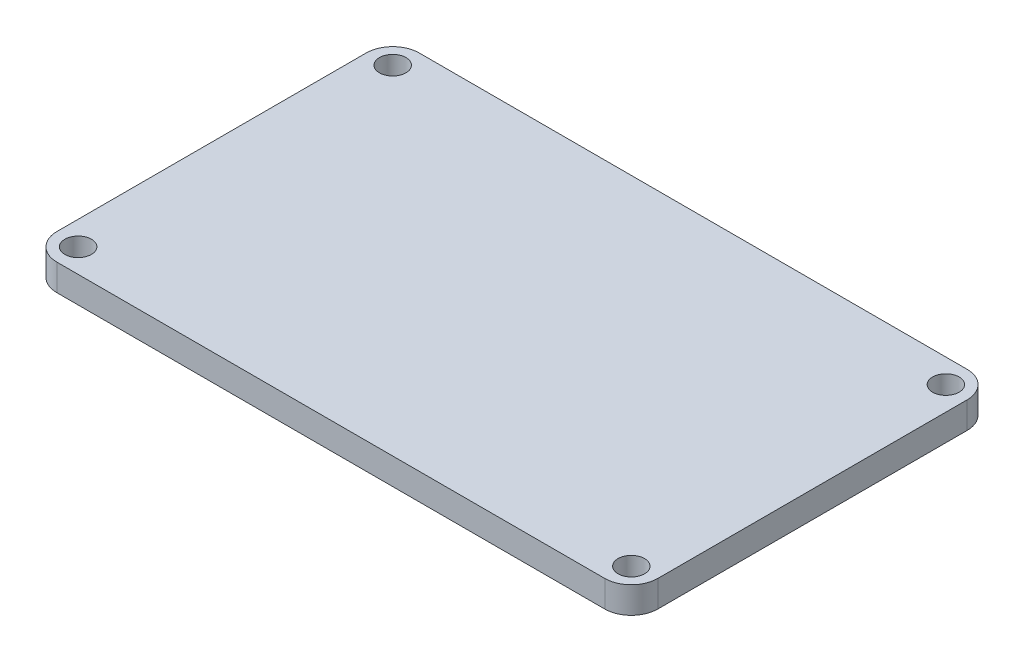
ISO-10303-21;
HEADER;
FILE_DESCRIPTION(('STEP AP214'),'2;1');
FILE_NAME('part.step','',(''),(''),'','','');
FILE_SCHEMA(('AUTOMOTIVE_DESIGN { 1 0 10303 214 1 1 1 1 }'));
ENDSEC;
DATA;
#1=APPLICATION_CONTEXT('core data for automotive mechanical design processes');
#2=APPLICATION_PROTOCOL_DEFINITION('international standard','automotive_design',2000,#1);
#3=PRODUCT_CONTEXT('',#1,'mechanical');
#4=PRODUCT('Part','Part','',(#3));
#5=PRODUCT_RELATED_PRODUCT_CATEGORY('part','',(#4));
#6=PRODUCT_DEFINITION_FORMATION('','',#4);
#7=PRODUCT_DEFINITION_CONTEXT('part definition',#1,'design');
#8=PRODUCT_DEFINITION('design','',#6,#7);
#9=PRODUCT_DEFINITION_SHAPE('','',#8);
#10=(LENGTH_UNIT() NAMED_UNIT(*) SI_UNIT(.MILLI.,.METRE.));
#11=(NAMED_UNIT(*) PLANE_ANGLE_UNIT() SI_UNIT($,.RADIAN.));
#12=(NAMED_UNIT(*) SI_UNIT($,.STERADIAN.) SOLID_ANGLE_UNIT());
#13=UNCERTAINTY_MEASURE_WITH_UNIT(LENGTH_MEASURE(1.E-05),#10,'distance_accuracy_value','');
#14=(GEOMETRIC_REPRESENTATION_CONTEXT(3) GLOBAL_UNCERTAINTY_ASSIGNED_CONTEXT((#13)) GLOBAL_UNIT_ASSIGNED_CONTEXT((#10,
#11,#12)) REPRESENTATION_CONTEXT('',''));
#15=CARTESIAN_POINT('',(0.,0.,0.));
#16=DIRECTION('',(0.,0.,1.));
#17=DIRECTION('',(1.,0.,0.));
#18=AXIS2_PLACEMENT_3D('',#15,#16,#17);
#19=CARTESIAN_POINT('',(31.,3.,17.5));
#20=DIRECTION('',(0.,-1.,0.));
#21=DIRECTION('',(0.,0.,-1.));
#22=AXIS2_PLACEMENT_3D('',#19,#20,#21);
#23=CYLINDRICAL_SURFACE('',#22,3.);
#24=DIRECTION('',(0.,-1.,0.));
#25=VECTOR('',#24,1.);
#26=CARTESIAN_POINT('',(34.,3.,17.5));
#27=LINE('',#26,#25);
#28=CARTESIAN_POINT('',(34.,3.,17.5));
#29=VERTEX_POINT('',#28);
#30=CARTESIAN_POINT('',(34.,0.,17.5));
#31=VERTEX_POINT('',#30);
#32=EDGE_CURVE('E165',#29,#31,#27,.T.);
#33=ORIENTED_EDGE('',*,*,#32,.F.);
#34=CARTESIAN_POINT('',(31.,3.,17.5));
#35=DIRECTION('',(0.,1.,0.));
#36=DIRECTION('',(0.,0.,1.));
#37=AXIS2_PLACEMENT_3D('',#34,#35,#36);
#38=CIRCLE('',#37,3.);
#39=CARTESIAN_POINT('',(31.,3.,20.5));
#40=VERTEX_POINT('',#39);
#41=EDGE_CURVE('E48',#40,#29,#38,.T.);
#42=ORIENTED_EDGE('',*,*,#41,.F.);
#43=DIRECTION('',(0.,-1.,0.));
#44=VECTOR('',#43,1.);
#45=CARTESIAN_POINT('',(31.,3.,20.5));
#46=LINE('',#45,#44);
#47=CARTESIAN_POINT('',(31.,0.,20.5));
#48=VERTEX_POINT('',#47);
#49=EDGE_CURVE('E168',#48,#40,#46,.F.);
#50=ORIENTED_EDGE('',*,*,#49,.F.);
#51=CARTESIAN_POINT('',(31.,0.,17.5));
#52=DIRECTION('',(0.,1.,0.));
#53=DIRECTION('',(0.,0.,1.));
#54=AXIS2_PLACEMENT_3D('',#51,#52,#53);
#55=CIRCLE('',#54,3.);
#56=EDGE_CURVE('E11',#31,#48,#55,.F.);
#57=ORIENTED_EDGE('',*,*,#56,.F.);
#58=EDGE_LOOP('',(#33,#42,#50,#57));
#59=FACE_BOUND('',#58,.T.);
#60=ADVANCED_FACE('F41',(#59),#23,.T.);
#61=CARTESIAN_POINT('',(-31.,3.,17.5));
#62=DIRECTION('',(0.,1.,0.));
#63=DIRECTION('',(0.,0.,1.));
#64=AXIS2_PLACEMENT_3D('',#61,#62,#63);
#65=CYLINDRICAL_SURFACE('',#64,3.);
#66=DIRECTION('',(0.,1.,0.));
#67=VECTOR('',#66,1.);
#68=CARTESIAN_POINT('',(-34.,3.,17.5));
#69=LINE('',#68,#67);
#70=CARTESIAN_POINT('',(-34.,0.,17.5));
#71=VERTEX_POINT('',#70);
#72=CARTESIAN_POINT('',(-34.,3.,17.5));
#73=VERTEX_POINT('',#72);
#74=EDGE_CURVE('E157',#71,#73,#69,.T.);
#75=ORIENTED_EDGE('',*,*,#74,.F.);
#76=CARTESIAN_POINT('',(-31.,0.,17.5));
#77=DIRECTION('',(0.,1.,0.));
#78=DIRECTION('',(0.,0.,1.));
#79=AXIS2_PLACEMENT_3D('',#76,#77,#78);
#80=CIRCLE('',#79,3.);
#81=CARTESIAN_POINT('',(-31.,0.,20.5));
#82=VERTEX_POINT('',#81);
#83=EDGE_CURVE('E128',#82,#71,#80,.F.);
#84=ORIENTED_EDGE('',*,*,#83,.F.);
#85=DIRECTION('',(0.,1.,0.));
#86=VECTOR('',#85,1.);
#87=CARTESIAN_POINT('',(-31.,3.,20.5));
#88=LINE('',#87,#86);
#89=CARTESIAN_POINT('',(-31.,3.,20.5));
#90=VERTEX_POINT('',#89);
#91=EDGE_CURVE('E159',#90,#82,#88,.F.);
#92=ORIENTED_EDGE('',*,*,#91,.F.);
#93=CARTESIAN_POINT('',(-31.,3.,17.5));
#94=DIRECTION('',(0.,1.,0.));
#95=DIRECTION('',(0.,0.,1.));
#96=AXIS2_PLACEMENT_3D('',#93,#94,#95);
#97=CIRCLE('',#96,3.);
#98=EDGE_CURVE('E163',#73,#90,#97,.T.);
#99=ORIENTED_EDGE('',*,*,#98,.F.);
#100=EDGE_LOOP('',(#75,#84,#92,#99));
#101=FACE_BOUND('',#100,.T.);
#102=ADVANCED_FACE('F224',(#101),#65,.T.);
#103=CARTESIAN_POINT('',(31.,3.,-17.5));
#104=DIRECTION('',(0.,1.,0.));
#105=DIRECTION('',(0.,0.,1.));
#106=AXIS2_PLACEMENT_3D('',#103,#104,#105);
#107=CYLINDRICAL_SURFACE('',#106,3.);
#108=DIRECTION('',(0.,1.,0.));
#109=VECTOR('',#108,1.);
#110=CARTESIAN_POINT('',(34.,3.,-17.5));
#111=LINE('',#110,#109);
#112=CARTESIAN_POINT('',(34.,0.,-17.5));
#113=VERTEX_POINT('',#112);
#114=CARTESIAN_POINT('',(34.,3.,-17.5));
#115=VERTEX_POINT('',#114);
#116=EDGE_CURVE('E114',#113,#115,#111,.T.);
#117=ORIENTED_EDGE('',*,*,#116,.F.);
#118=CARTESIAN_POINT('',(31.,0.,-17.5));
#119=DIRECTION('',(0.,1.,0.));
#120=DIRECTION('',(0.,0.,1.));
#121=AXIS2_PLACEMENT_3D('',#118,#119,#120);
#122=CIRCLE('',#121,3.);
#123=CARTESIAN_POINT('',(31.,0.,-20.5));
#124=VERTEX_POINT('',#123);
#125=EDGE_CURVE('E152',#124,#113,#122,.F.);
#126=ORIENTED_EDGE('',*,*,#125,.F.);
#127=DIRECTION('',(0.,1.,0.));
#128=VECTOR('',#127,1.);
#129=CARTESIAN_POINT('',(31.,3.,-20.5));
#130=LINE('',#129,#128);
#131=CARTESIAN_POINT('',(31.,3.,-20.5));
#132=VERTEX_POINT('',#131);
#133=EDGE_CURVE('E149',#132,#124,#130,.F.);
#134=ORIENTED_EDGE('',*,*,#133,.F.);
#135=CARTESIAN_POINT('',(31.,3.,-17.5));
#136=DIRECTION('',(0.,1.,0.));
#137=DIRECTION('',(0.,0.,1.));
#138=AXIS2_PLACEMENT_3D('',#135,#136,#137);
#139=CIRCLE('',#138,3.);
#140=EDGE_CURVE('E155',#115,#132,#139,.T.);
#141=ORIENTED_EDGE('',*,*,#140,.F.);
#142=EDGE_LOOP('',(#117,#126,#134,#141));
#143=FACE_BOUND('',#142,.T.);
#144=ADVANCED_FACE('F228',(#143),#107,.T.);
#145=CARTESIAN_POINT('',(-31.,3.,-17.5));
#146=DIRECTION('',(0.,-1.,0.));
#147=DIRECTION('',(0.,0.,-1.));
#148=AXIS2_PLACEMENT_3D('',#145,#146,#147);
#149=CYLINDRICAL_SURFACE('',#148,3.);
#150=DIRECTION('',(0.,-1.,0.));
#151=VECTOR('',#150,1.);
#152=CARTESIAN_POINT('',(-34.,3.,-17.5));
#153=LINE('',#152,#151);
#154=CARTESIAN_POINT('',(-34.,3.,-17.5));
#155=VERTEX_POINT('',#154);
#156=CARTESIAN_POINT('',(-34.,0.,-17.5));
#157=VERTEX_POINT('',#156);
#158=EDGE_CURVE('E108',#155,#157,#153,.T.);
#159=ORIENTED_EDGE('',*,*,#158,.F.);
#160=CARTESIAN_POINT('',(-31.,3.,-17.5));
#161=DIRECTION('',(0.,1.,0.));
#162=DIRECTION('',(0.,0.,1.));
#163=AXIS2_PLACEMENT_3D('',#160,#161,#162);
#164=CIRCLE('',#163,3.);
#165=CARTESIAN_POINT('',(-31.,3.,-20.5));
#166=VERTEX_POINT('',#165);
#167=EDGE_CURVE('E115',#166,#155,#164,.T.);
#168=ORIENTED_EDGE('',*,*,#167,.F.);
#169=DIRECTION('',(0.,-1.,0.));
#170=VECTOR('',#169,1.);
#171=CARTESIAN_POINT('',(-31.,3.,-20.5));
#172=LINE('',#171,#170);
#173=CARTESIAN_POINT('',(-31.,0.,-20.5));
#174=VERTEX_POINT('',#173);
#175=EDGE_CURVE('E111',#174,#166,#172,.F.);
#176=ORIENTED_EDGE('',*,*,#175,.F.);
#177=CARTESIAN_POINT('',(-31.,0.,-17.5));
#178=DIRECTION('',(0.,1.,0.));
#179=DIRECTION('',(0.,0.,1.));
#180=AXIS2_PLACEMENT_3D('',#177,#178,#179);
#181=CIRCLE('',#180,3.);
#182=EDGE_CURVE('E104',#157,#174,#181,.F.);
#183=ORIENTED_EDGE('',*,*,#182,.F.);
#184=EDGE_LOOP('',(#159,#168,#176,#183));
#185=FACE_BOUND('',#184,.T.);
#186=ADVANCED_FACE('F106',(#185),#149,.T.);
#187=CARTESIAN_POINT('',(0.,3.,0.));
#188=DIRECTION('',(0.,1.,0.));
#189=DIRECTION('',(0.,0.,1.));
#190=AXIS2_PLACEMENT_3D('',#187,#188,#189);
#191=PLANE('',#190);
#192=CARTESIAN_POINT('',(-31.3,3.,17.8));
#193=DIRECTION('',(0.,1.,0.));
#194=DIRECTION('',(0.,0.,1.));
#195=AXIS2_PLACEMENT_3D('',#192,#193,#194);
#196=CIRCLE('',#195,1.5);
#197=CARTESIAN_POINT('',(-31.3,3.,19.3));
#198=VERTEX_POINT('',#197);
#199=EDGE_CURVE('E185',#198,#198,#196,.F.);
#200=ORIENTED_EDGE('',*,*,#199,.T.);
#201=EDGE_LOOP('',(#200));
#202=FACE_BOUND('',#201,.T.);
#203=CARTESIAN_POINT('',(31.3,3.,-17.8));
#204=DIRECTION('',(0.,1.,0.));
#205=DIRECTION('',(0.,0.,1.));
#206=AXIS2_PLACEMENT_3D('',#203,#204,#205);
#207=CIRCLE('',#206,1.5);
#208=CARTESIAN_POINT('',(31.3,3.,-16.3));
#209=VERTEX_POINT('',#208);
#210=EDGE_CURVE('E137',#209,#209,#207,.F.);
#211=ORIENTED_EDGE('',*,*,#210,.T.);
#212=EDGE_LOOP('',(#211));
#213=FACE_BOUND('',#212,.T.);
#214=DIRECTION('',(1.,0.,0.));
#215=VECTOR('',#214,1.);
#216=CARTESIAN_POINT('',(34.,3.,20.5));
#217=LINE('',#216,#215);
#218=EDGE_CURVE('E177',#90,#40,#217,.T.);
#219=ORIENTED_EDGE('',*,*,#218,.T.);
#220=ORIENTED_EDGE('',*,*,#41,.T.);
#221=DIRECTION('',(0.,0.,-1.));
#222=VECTOR('',#221,1.);
#223=CARTESIAN_POINT('',(34.,3.,20.5));
#224=LINE('',#223,#222);
#225=EDGE_CURVE('E174',#29,#115,#224,.T.);
#226=ORIENTED_EDGE('',*,*,#225,.T.);
#227=ORIENTED_EDGE('',*,*,#140,.T.);
#228=DIRECTION('',(-1.,0.,0.));
#229=VECTOR('',#228,1.);
#230=CARTESIAN_POINT('',(34.,3.,-20.5));
#231=LINE('',#230,#229);
#232=EDGE_CURVE('E124',#132,#166,#231,.T.);
#233=ORIENTED_EDGE('',*,*,#232,.T.);
#234=ORIENTED_EDGE('',*,*,#167,.T.);
#235=DIRECTION('',(0.,0.,1.));
#236=VECTOR('',#235,1.);
#237=CARTESIAN_POINT('',(-34.,3.,20.5));
#238=LINE('',#237,#236);
#239=EDGE_CURVE('E123',#155,#73,#238,.T.);
#240=ORIENTED_EDGE('',*,*,#239,.T.);
#241=ORIENTED_EDGE('',*,*,#98,.T.);
#242=EDGE_LOOP('',(#219,#220,#226,#227,#233,#234,#240,#241));
#243=FACE_BOUND('',#242,.T.);
#244=CARTESIAN_POINT('',(31.3,3.,17.8));
#245=DIRECTION('',(0.,1.,0.));
#246=DIRECTION('',(0.,0.,1.));
#247=AXIS2_PLACEMENT_3D('',#244,#245,#246);
#248=CIRCLE('',#247,1.5);
#249=CARTESIAN_POINT('',(31.3,3.,19.3));
#250=VERTEX_POINT('',#249);
#251=EDGE_CURVE('E196',#250,#250,#248,.T.);
#252=ORIENTED_EDGE('',*,*,#251,.F.);
#253=EDGE_LOOP('',(#252));
#254=FACE_BOUND('',#253,.T.);
#255=CARTESIAN_POINT('',(-31.3,3.,-17.8));
#256=DIRECTION('',(0.,1.,0.));
#257=DIRECTION('',(0.,0.,1.));
#258=AXIS2_PLACEMENT_3D('',#255,#256,#257);
#259=CIRCLE('',#258,1.5);
#260=CARTESIAN_POINT('',(-31.3,3.,-16.3));
#261=VERTEX_POINT('',#260);
#262=EDGE_CURVE('E190',#261,#261,#259,.T.);
#263=ORIENTED_EDGE('',*,*,#262,.F.);
#264=EDGE_LOOP('',(#263));
#265=FACE_BOUND('',#264,.T.);
#266=ADVANCED_FACE('F171',(#202,#213,#243,#254,#265),#191,.T.);
#267=CARTESIAN_POINT('',(0.,0.,0.));
#268=DIRECTION('',(0.,1.,0.));
#269=DIRECTION('',(0.,0.,1.));
#270=AXIS2_PLACEMENT_3D('',#267,#268,#269);
#271=PLANE('',#270);
#272=CARTESIAN_POINT('',(31.3,0.,17.8));
#273=DIRECTION('',(0.,1.,0.));
#274=DIRECTION('',(0.,0.,1.));
#275=AXIS2_PLACEMENT_3D('',#272,#273,#274);
#276=CIRCLE('',#275,1.5);
#277=CARTESIAN_POINT('',(31.3,0.,19.3));
#278=VERTEX_POINT('',#277);
#279=EDGE_CURVE('E193',#278,#278,#276,.T.);
#280=ORIENTED_EDGE('',*,*,#279,.T.);
#281=EDGE_LOOP('',(#280));
#282=FACE_BOUND('',#281,.T.);
#283=CARTESIAN_POINT('',(-31.3,0.,17.8));
#284=DIRECTION('',(0.,1.,0.));
#285=DIRECTION('',(0.,0.,1.));
#286=AXIS2_PLACEMENT_3D('',#283,#284,#285);
#287=CIRCLE('',#286,1.5);
#288=CARTESIAN_POINT('',(-31.3,0.,19.3));
#289=VERTEX_POINT('',#288);
#290=EDGE_CURVE('E199',#289,#289,#287,.F.);
#291=ORIENTED_EDGE('',*,*,#290,.F.);
#292=EDGE_LOOP('',(#291));
#293=FACE_BOUND('',#292,.T.);
#294=CARTESIAN_POINT('',(31.3,0.,-17.8));
#295=DIRECTION('',(0.,1.,0.));
#296=DIRECTION('',(0.,0.,1.));
#297=AXIS2_PLACEMENT_3D('',#294,#295,#296);
#298=CIRCLE('',#297,1.5);
#299=CARTESIAN_POINT('',(31.3,0.,-16.3));
#300=VERTEX_POINT('',#299);
#301=EDGE_CURVE('E131',#300,#300,#298,.F.);
#302=ORIENTED_EDGE('',*,*,#301,.F.);
#303=EDGE_LOOP('',(#302));
#304=FACE_BOUND('',#303,.T.);
#305=DIRECTION('',(0.,0.,-1.));
#306=VECTOR('',#305,1.);
#307=CARTESIAN_POINT('',(34.,0.,20.5));
#308=LINE('',#307,#306);
#309=EDGE_CURVE('E134',#31,#113,#308,.T.);
#310=ORIENTED_EDGE('',*,*,#309,.F.);
#311=ORIENTED_EDGE('',*,*,#56,.T.);
#312=DIRECTION('',(1.,0.,0.));
#313=VECTOR('',#312,1.);
#314=CARTESIAN_POINT('',(34.,0.,20.5));
#315=LINE('',#314,#313);
#316=EDGE_CURVE('E130',#82,#48,#315,.T.);
#317=ORIENTED_EDGE('',*,*,#316,.F.);
#318=ORIENTED_EDGE('',*,*,#83,.T.);
#319=DIRECTION('',(0.,0.,1.));
#320=VECTOR('',#319,1.);
#321=CARTESIAN_POINT('',(-34.,0.,20.5));
#322=LINE('',#321,#320);
#323=EDGE_CURVE('E121',#157,#71,#322,.T.);
#324=ORIENTED_EDGE('',*,*,#323,.F.);
#325=ORIENTED_EDGE('',*,*,#182,.T.);
#326=DIRECTION('',(-1.,0.,0.));
#327=VECTOR('',#326,1.);
#328=CARTESIAN_POINT('',(34.,0.,-20.5));
#329=LINE('',#328,#327);
#330=EDGE_CURVE('E143',#124,#174,#329,.T.);
#331=ORIENTED_EDGE('',*,*,#330,.F.);
#332=ORIENTED_EDGE('',*,*,#125,.T.);
#333=EDGE_LOOP('',(#310,#311,#317,#318,#324,#325,#331,#332));
#334=FACE_BOUND('',#333,.T.);
#335=CARTESIAN_POINT('',(-31.3,0.,-17.8));
#336=DIRECTION('',(0.,1.,0.));
#337=DIRECTION('',(0.,0.,1.));
#338=AXIS2_PLACEMENT_3D('',#335,#336,#337);
#339=CIRCLE('',#338,1.5);
#340=CARTESIAN_POINT('',(-31.3,0.,-16.3));
#341=VERTEX_POINT('',#340);
#342=EDGE_CURVE('E187',#341,#341,#339,.T.);
#343=ORIENTED_EDGE('',*,*,#342,.T.);
#344=EDGE_LOOP('',(#343));
#345=FACE_BOUND('',#344,.T.);
#346=ADVANCED_FACE('F126',(#282,#293,#304,#334,#345),#271,.F.);
#347=CARTESIAN_POINT('',(-34.,3.,20.5));
#348=DIRECTION('',(1.,0.,0.));
#349=DIRECTION('',(0.,0.,-1.));
#350=AXIS2_PLACEMENT_3D('',#347,#348,#349);
#351=PLANE('',#350);
#352=ORIENTED_EDGE('',*,*,#323,.T.);
#353=ORIENTED_EDGE('',*,*,#74,.T.);
#354=ORIENTED_EDGE('',*,*,#239,.F.);
#355=ORIENTED_EDGE('',*,*,#158,.T.);
#356=EDGE_LOOP('',(#352,#353,#354,#355));
#357=FACE_BOUND('',#356,.T.);
#358=ADVANCED_FACE('F119',(#357),#351,.F.);
#359=CARTESIAN_POINT('',(34.,3.,20.5));
#360=DIRECTION('',(0.,0.,-1.));
#361=DIRECTION('',(-1.,0.,0.));
#362=AXIS2_PLACEMENT_3D('',#359,#360,#361);
#363=PLANE('',#362);
#364=ORIENTED_EDGE('',*,*,#316,.T.);
#365=ORIENTED_EDGE('',*,*,#49,.T.);
#366=ORIENTED_EDGE('',*,*,#218,.F.);
#367=ORIENTED_EDGE('',*,*,#91,.T.);
#368=EDGE_LOOP('',(#364,#365,#366,#367));
#369=FACE_BOUND('',#368,.T.);
#370=ADVANCED_FACE('F240',(#369),#363,.F.);
#371=CARTESIAN_POINT('',(34.,3.,20.5));
#372=DIRECTION('',(-1.,0.,0.));
#373=DIRECTION('',(0.,0.,1.));
#374=AXIS2_PLACEMENT_3D('',#371,#372,#373);
#375=PLANE('',#374);
#376=ORIENTED_EDGE('',*,*,#225,.F.);
#377=ORIENTED_EDGE('',*,*,#32,.T.);
#378=ORIENTED_EDGE('',*,*,#309,.T.);
#379=ORIENTED_EDGE('',*,*,#116,.T.);
#380=EDGE_LOOP('',(#376,#377,#378,#379));
#381=FACE_BOUND('',#380,.T.);
#382=ADVANCED_FACE('F179',(#381),#375,.F.);
#383=CARTESIAN_POINT('',(34.,3.,-20.5));
#384=DIRECTION('',(0.,0.,1.));
#385=DIRECTION('',(1.,0.,0.));
#386=AXIS2_PLACEMENT_3D('',#383,#384,#385);
#387=PLANE('',#386);
#388=ORIENTED_EDGE('',*,*,#232,.F.);
#389=ORIENTED_EDGE('',*,*,#133,.T.);
#390=ORIENTED_EDGE('',*,*,#330,.T.);
#391=ORIENTED_EDGE('',*,*,#175,.T.);
#392=EDGE_LOOP('',(#388,#389,#390,#391));
#393=FACE_BOUND('',#392,.T.);
#394=ADVANCED_FACE('F220',(#393),#387,.F.);
#395=CARTESIAN_POINT('',(31.3,0.,-17.8));
#396=DIRECTION('',(0.,1.,0.));
#397=DIRECTION('',(0.,0.,1.));
#398=AXIS2_PLACEMENT_3D('',#395,#396,#397);
#399=CYLINDRICAL_SURFACE('',#398,1.5);
#400=ORIENTED_EDGE('',*,*,#301,.T.);
#401=EDGE_LOOP('',(#400));
#402=FACE_BOUND('',#401,.T.);
#403=ORIENTED_EDGE('',*,*,#210,.F.);
#404=EDGE_LOOP('',(#403));
#405=FACE_BOUND('',#404,.T.);
#406=ADVANCED_FACE('F210',(#402,#405),#399,.F.);
#407=CARTESIAN_POINT('',(-31.3,0.,17.8));
#408=DIRECTION('',(0.,1.,0.));
#409=DIRECTION('',(0.,0.,1.));
#410=AXIS2_PLACEMENT_3D('',#407,#408,#409);
#411=CYLINDRICAL_SURFACE('',#410,1.5);
#412=ORIENTED_EDGE('',*,*,#290,.T.);
#413=EDGE_LOOP('',(#412));
#414=FACE_BOUND('',#413,.T.);
#415=ORIENTED_EDGE('',*,*,#199,.F.);
#416=EDGE_LOOP('',(#415));
#417=FACE_BOUND('',#416,.T.);
#418=ADVANCED_FACE('F207',(#414,#417),#411,.F.);
#419=CARTESIAN_POINT('',(31.3,0.,17.8));
#420=DIRECTION('',(0.,1.,0.));
#421=DIRECTION('',(0.,0.,1.));
#422=AXIS2_PLACEMENT_3D('',#419,#420,#421);
#423=CYLINDRICAL_SURFACE('',#422,1.5);
#424=ORIENTED_EDGE('',*,*,#279,.F.);
#425=EDGE_LOOP('',(#424));
#426=FACE_BOUND('',#425,.T.);
#427=ORIENTED_EDGE('',*,*,#251,.T.);
#428=EDGE_LOOP('',(#427));
#429=FACE_BOUND('',#428,.T.);
#430=ADVANCED_FACE('F209',(#426,#429),#423,.F.);
#431=CARTESIAN_POINT('',(-31.3,0.,-17.8));
#432=DIRECTION('',(0.,1.,0.));
#433=DIRECTION('',(0.,0.,1.));
#434=AXIS2_PLACEMENT_3D('',#431,#432,#433);
#435=CYLINDRICAL_SURFACE('',#434,1.5);
#436=ORIENTED_EDGE('',*,*,#342,.F.);
#437=EDGE_LOOP('',(#436));
#438=FACE_BOUND('',#437,.T.);
#439=ORIENTED_EDGE('',*,*,#262,.T.);
#440=EDGE_LOOP('',(#439));
#441=FACE_BOUND('',#440,.T.);
#442=ADVANCED_FACE('F217',(#438,#441),#435,.F.);
#443=CLOSED_SHELL('',(#60,#102,#144,#186,#266,#346,#358,#370,#382,#394,#406,#418,#430,#442));
#444=MANIFOLD_SOLID_BREP('B2',#443);
#445=ADVANCED_BREP_SHAPE_REPRESENTATION('',(#18,#444),#14);
#446=SHAPE_DEFINITION_REPRESENTATION(#9,#445);
ENDSEC;
END-ISO-10303-21;
